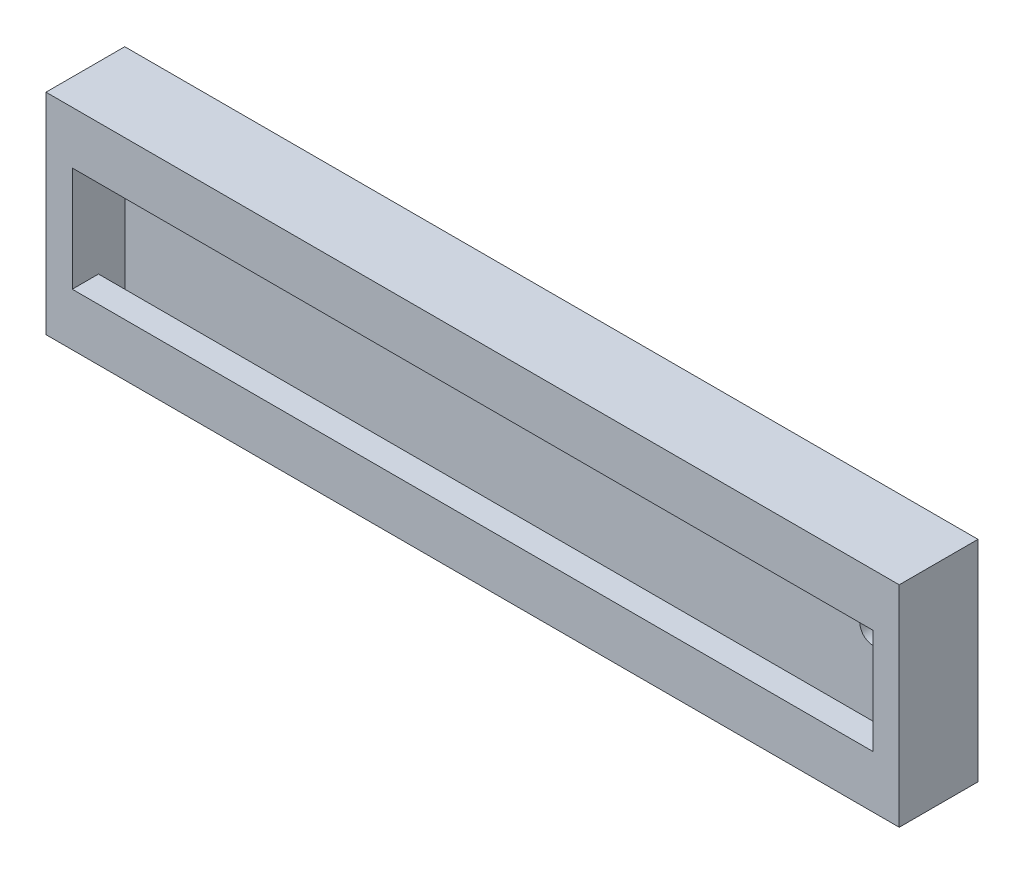
ISO-10303-21;
HEADER;
FILE_DESCRIPTION(('STEP AP214'),'2;1');
FILE_NAME('part.step','',(''),(''),'','','');
FILE_SCHEMA(('AUTOMOTIVE_DESIGN { 1 0 10303 214 1 1 1 1 }'));
ENDSEC;
DATA;
#1=APPLICATION_CONTEXT('core data for automotive mechanical design processes');
#2=APPLICATION_PROTOCOL_DEFINITION('international standard','automotive_design',2000,#1);
#3=PRODUCT_CONTEXT('',#1,'mechanical');
#4=PRODUCT('Part','Part','',(#3));
#5=PRODUCT_RELATED_PRODUCT_CATEGORY('part','',(#4));
#6=PRODUCT_DEFINITION_FORMATION('','',#4);
#7=PRODUCT_DEFINITION_CONTEXT('part definition',#1,'design');
#8=PRODUCT_DEFINITION('design','',#6,#7);
#9=PRODUCT_DEFINITION_SHAPE('','',#8);
#10=(LENGTH_UNIT() NAMED_UNIT(*) SI_UNIT(.MILLI.,.METRE.));
#11=(NAMED_UNIT(*) PLANE_ANGLE_UNIT() SI_UNIT($,.RADIAN.));
#12=(NAMED_UNIT(*) SI_UNIT($,.STERADIAN.) SOLID_ANGLE_UNIT());
#13=UNCERTAINTY_MEASURE_WITH_UNIT(LENGTH_MEASURE(1.E-05),#10,'distance_accuracy_value','');
#14=(GEOMETRIC_REPRESENTATION_CONTEXT(3) GLOBAL_UNCERTAINTY_ASSIGNED_CONTEXT((#13)) GLOBAL_UNIT_ASSIGNED_CONTEXT((#10,
#11,#12)) REPRESENTATION_CONTEXT('',''));
#15=CARTESIAN_POINT('',(0.,0.,0.));
#16=DIRECTION('',(0.,0.,1.));
#17=DIRECTION('',(1.,0.,0.));
#18=AXIS2_PLACEMENT_3D('',#15,#16,#17);
#19=CARTESIAN_POINT('',(32.5,-8.,2.));
#20=DIRECTION('',(-1.,0.,0.));
#21=DIRECTION('',(0.,0.,1.));
#22=AXIS2_PLACEMENT_3D('',#19,#20,#21);
#23=PLANE('',#22);
#24=DIRECTION('',(0.,1.,0.));
#25=VECTOR('',#24,1.);
#26=CARTESIAN_POINT('',(32.5,-8.,0.));
#27=LINE('',#26,#25);
#28=CARTESIAN_POINT('',(32.5,-8.,0.));
#29=VERTEX_POINT('',#28);
#30=CARTESIAN_POINT('',(32.5,8.,0.));
#31=VERTEX_POINT('',#30);
#32=EDGE_CURVE('E215',#29,#31,#27,.T.);
#33=ORIENTED_EDGE('',*,*,#32,.T.);
#34=DIRECTION('',(0.,0.,-1.));
#35=VECTOR('',#34,1.);
#36=CARTESIAN_POINT('',(32.5,8.,2.));
#37=LINE('',#36,#35);
#38=CARTESIAN_POINT('',(32.5,8.,6.));
#39=VERTEX_POINT('',#38);
#40=EDGE_CURVE('E11',#39,#31,#37,.T.);
#41=ORIENTED_EDGE('',*,*,#40,.F.);
#42=DIRECTION('',(0.,1.,0.));
#43=VECTOR('',#42,1.);
#44=CARTESIAN_POINT('',(32.5,8.,6.));
#45=LINE('',#44,#43);
#46=CARTESIAN_POINT('',(32.5,-8.,6.));
#47=VERTEX_POINT('',#46);
#48=EDGE_CURVE('E150',#47,#39,#45,.T.);
#49=ORIENTED_EDGE('',*,*,#48,.F.);
#50=DIRECTION('',(0.,0.,-1.));
#51=VECTOR('',#50,1.);
#52=CARTESIAN_POINT('',(32.5,-8.,2.));
#53=LINE('',#52,#51);
#54=EDGE_CURVE('E223',#47,#29,#53,.T.);
#55=ORIENTED_EDGE('',*,*,#54,.T.);
#56=EDGE_LOOP('',(#33,#41,#49,#55));
#57=FACE_BOUND('',#56,.T.);
#58=ADVANCED_FACE('F39',(#57),#23,.F.);
#59=CARTESIAN_POINT('',(-32.5,8.,2.));
#60=DIRECTION('',(0.,-1.,0.));
#61=DIRECTION('',(0.,0.,-1.));
#62=AXIS2_PLACEMENT_3D('',#59,#60,#61);
#63=PLANE('',#62);
#64=DIRECTION('',(-1.,0.,0.));
#65=VECTOR('',#64,1.);
#66=CARTESIAN_POINT('',(-32.5,8.,0.));
#67=LINE('',#66,#65);
#68=CARTESIAN_POINT('',(-32.5,8.,0.));
#69=VERTEX_POINT('',#68);
#70=EDGE_CURVE('E218',#31,#69,#67,.T.);
#71=ORIENTED_EDGE('',*,*,#70,.T.);
#72=DIRECTION('',(0.,0.,-1.));
#73=VECTOR('',#72,1.);
#74=CARTESIAN_POINT('',(-32.5,8.,2.));
#75=LINE('',#74,#73);
#76=CARTESIAN_POINT('',(-32.5,8.,6.));
#77=VERTEX_POINT('',#76);
#78=EDGE_CURVE('E46',#77,#69,#75,.T.);
#79=ORIENTED_EDGE('',*,*,#78,.F.);
#80=DIRECTION('',(-1.,0.,0.));
#81=VECTOR('',#80,1.);
#82=CARTESIAN_POINT('',(-32.5,8.,6.));
#83=LINE('',#82,#81);
#84=EDGE_CURVE('E174',#39,#77,#83,.T.);
#85=ORIENTED_EDGE('',*,*,#84,.F.);
#86=ORIENTED_EDGE('',*,*,#40,.T.);
#87=EDGE_LOOP('',(#71,#79,#85,#86));
#88=FACE_BOUND('',#87,.T.);
#89=ADVANCED_FACE('F241',(#88),#63,.F.);
#90=CARTESIAN_POINT('',(-32.5,-8.,2.));
#91=DIRECTION('',(1.,0.,0.));
#92=DIRECTION('',(0.,0.,-1.));
#93=AXIS2_PLACEMENT_3D('',#90,#91,#92);
#94=PLANE('',#93);
#95=DIRECTION('',(0.,-1.,0.));
#96=VECTOR('',#95,1.);
#97=CARTESIAN_POINT('',(-32.5,-8.,0.));
#98=LINE('',#97,#96);
#99=CARTESIAN_POINT('',(-32.5,-8.,0.));
#100=VERTEX_POINT('',#99);
#101=EDGE_CURVE('E220',#69,#100,#98,.T.);
#102=ORIENTED_EDGE('',*,*,#101,.T.);
#103=DIRECTION('',(0.,0.,-1.));
#104=VECTOR('',#103,1.);
#105=CARTESIAN_POINT('',(-32.5,-8.,2.));
#106=LINE('',#105,#104);
#107=CARTESIAN_POINT('',(-32.5,-8.,6.));
#108=VERTEX_POINT('',#107);
#109=EDGE_CURVE('E225',#108,#100,#106,.T.);
#110=ORIENTED_EDGE('',*,*,#109,.F.);
#111=DIRECTION('',(0.,-1.,0.));
#112=VECTOR('',#111,1.);
#113=CARTESIAN_POINT('',(-32.5,8.,6.));
#114=LINE('',#113,#112);
#115=EDGE_CURVE('E177',#77,#108,#114,.T.);
#116=ORIENTED_EDGE('',*,*,#115,.F.);
#117=ORIENTED_EDGE('',*,*,#78,.T.);
#118=EDGE_LOOP('',(#102,#110,#116,#117));
#119=FACE_BOUND('',#118,.T.);
#120=ADVANCED_FACE('F230',(#119),#94,.F.);
#121=CARTESIAN_POINT('',(-32.5,-8.,2.));
#122=DIRECTION('',(0.,1.,0.));
#123=DIRECTION('',(0.,0.,1.));
#124=AXIS2_PLACEMENT_3D('',#121,#122,#123);
#125=PLANE('',#124);
#126=DIRECTION('',(1.,0.,0.));
#127=VECTOR('',#126,1.);
#128=CARTESIAN_POINT('',(-32.5,-8.,0.));
#129=LINE('',#128,#127);
#130=EDGE_CURVE('E61',#100,#29,#129,.T.);
#131=ORIENTED_EDGE('',*,*,#130,.T.);
#132=ORIENTED_EDGE('',*,*,#54,.F.);
#133=DIRECTION('',(1.,0.,0.));
#134=VECTOR('',#133,1.);
#135=CARTESIAN_POINT('',(-32.5,-8.,6.));
#136=LINE('',#135,#134);
#137=EDGE_CURVE('E180',#108,#47,#136,.T.);
#138=ORIENTED_EDGE('',*,*,#137,.F.);
#139=ORIENTED_EDGE('',*,*,#109,.T.);
#140=EDGE_LOOP('',(#131,#132,#138,#139));
#141=FACE_BOUND('',#140,.T.);
#142=ADVANCED_FACE('F239',(#141),#125,.F.);
#143=CARTESIAN_POINT('',(0.,0.,0.));
#144=DIRECTION('',(0.,0.,-1.));
#145=DIRECTION('',(-1.,0.,0.));
#146=AXIS2_PLACEMENT_3D('',#143,#144,#145);
#147=PLANE('',#146);
#148=CARTESIAN_POINT('',(26.5,0.,0.));
#149=DIRECTION('',(0.,0.,1.));
#150=DIRECTION('',(1.,0.,0.));
#151=AXIS2_PLACEMENT_3D('',#148,#149,#150);
#152=CIRCLE('',#151,1.);
#153=CARTESIAN_POINT('',(27.5,0.,0.));
#154=VERTEX_POINT('',#153);
#155=EDGE_CURVE('E164',#154,#154,#152,.T.);
#156=ORIENTED_EDGE('',*,*,#155,.T.);
#157=EDGE_LOOP('',(#156));
#158=FACE_BOUND('',#157,.T.);
#159=ORIENTED_EDGE('',*,*,#32,.F.);
#160=ORIENTED_EDGE('',*,*,#130,.F.);
#161=ORIENTED_EDGE('',*,*,#101,.F.);
#162=ORIENTED_EDGE('',*,*,#70,.F.);
#163=EDGE_LOOP('',(#159,#160,#161,#162));
#164=FACE_BOUND('',#163,.T.);
#165=ADVANCED_FACE('F235',(#158,#164),#147,.T.);
#166=CARTESIAN_POINT('',(0.,0.,4.));
#167=DIRECTION('',(0.,0.,1.));
#168=DIRECTION('',(1.,0.,0.));
#169=AXIS2_PLACEMENT_3D('',#166,#167,#168);
#170=PLANE('',#169);
#171=DIRECTION('',(0.,1.,0.));
#172=VECTOR('',#171,1.);
#173=CARTESIAN_POINT('',(30.5,6.,4.));
#174=LINE('',#173,#172);
#175=CARTESIAN_POINT('',(30.5,4.,4.));
#176=VERTEX_POINT('',#175);
#177=CARTESIAN_POINT('',(30.5,6.,4.));
#178=VERTEX_POINT('',#177);
#179=EDGE_CURVE('E187',#176,#178,#174,.T.);
#180=ORIENTED_EDGE('',*,*,#179,.F.);
#181=DIRECTION('',(-1.,0.,0.));
#182=VECTOR('',#181,1.);
#183=CARTESIAN_POINT('',(-30.5,4.,4.));
#184=LINE('',#183,#182);
#185=CARTESIAN_POINT('',(-30.5,4.,4.));
#186=VERTEX_POINT('',#185);
#187=EDGE_CURVE('E149',#176,#186,#184,.T.);
#188=ORIENTED_EDGE('',*,*,#187,.T.);
#189=DIRECTION('',(0.,-1.,0.));
#190=VECTOR('',#189,1.);
#191=CARTESIAN_POINT('',(-30.5,6.,4.));
#192=LINE('',#191,#190);
#193=CARTESIAN_POINT('',(-30.5,6.,4.));
#194=VERTEX_POINT('',#193);
#195=EDGE_CURVE('E191',#194,#186,#192,.T.);
#196=ORIENTED_EDGE('',*,*,#195,.F.);
#197=DIRECTION('',(-1.,0.,0.));
#198=VECTOR('',#197,1.);
#199=CARTESIAN_POINT('',(-30.5,6.,4.));
#200=LINE('',#199,#198);
#201=EDGE_CURVE('E186',#178,#194,#200,.T.);
#202=ORIENTED_EDGE('',*,*,#201,.F.);
#203=EDGE_LOOP('',(#180,#188,#196,#202));
#204=FACE_BOUND('',#203,.T.);
#205=ADVANCED_FACE('F253',(#204),#170,.F.);
#206=CARTESIAN_POINT('',(0.,0.,6.));
#207=DIRECTION('',(0.,0.,1.));
#208=DIRECTION('',(1.,0.,0.));
#209=AXIS2_PLACEMENT_3D('',#206,#207,#208);
#210=PLANE('',#209);
#211=ORIENTED_EDGE('',*,*,#48,.T.);
#212=ORIENTED_EDGE('',*,*,#84,.T.);
#213=ORIENTED_EDGE('',*,*,#115,.T.);
#214=ORIENTED_EDGE('',*,*,#137,.T.);
#215=EDGE_LOOP('',(#211,#212,#213,#214));
#216=FACE_BOUND('',#215,.T.);
#217=DIRECTION('',(-1.,0.,0.));
#218=VECTOR('',#217,1.);
#219=CARTESIAN_POINT('',(-30.5,4.,6.));
#220=LINE('',#219,#218);
#221=CARTESIAN_POINT('',(30.5,4.,6.));
#222=VERTEX_POINT('',#221);
#223=CARTESIAN_POINT('',(-30.5,4.,6.));
#224=VERTEX_POINT('',#223);
#225=EDGE_CURVE('E141',#222,#224,#220,.T.);
#226=ORIENTED_EDGE('',*,*,#225,.F.);
#227=DIRECTION('',(0.,1.,0.));
#228=VECTOR('',#227,1.);
#229=CARTESIAN_POINT('',(30.5,4.,6.));
#230=LINE('',#229,#228);
#231=CARTESIAN_POINT('',(30.5,-4.,6.));
#232=VERTEX_POINT('',#231);
#233=EDGE_CURVE('E131',#232,#222,#230,.T.);
#234=ORIENTED_EDGE('',*,*,#233,.F.);
#235=DIRECTION('',(1.,0.,0.));
#236=VECTOR('',#235,1.);
#237=CARTESIAN_POINT('',(-30.5,-4.,6.));
#238=LINE('',#237,#236);
#239=CARTESIAN_POINT('',(-30.5,-4.,6.));
#240=VERTEX_POINT('',#239);
#241=EDGE_CURVE('E158',#240,#232,#238,.T.);
#242=ORIENTED_EDGE('',*,*,#241,.F.);
#243=DIRECTION('',(0.,-1.,0.));
#244=VECTOR('',#243,1.);
#245=CARTESIAN_POINT('',(-30.5,4.,6.));
#246=LINE('',#245,#244);
#247=EDGE_CURVE('E156',#224,#240,#246,.T.);
#248=ORIENTED_EDGE('',*,*,#247,.F.);
#249=EDGE_LOOP('',(#226,#234,#242,#248));
#250=FACE_BOUND('',#249,.T.);
#251=ADVANCED_FACE('F154',(#216,#250),#210,.T.);
#252=CARTESIAN_POINT('',(30.5,-6.,4.));
#253=VERTEX_POINT('',#252);
#254=CARTESIAN_POINT('',(30.5,-4.,4.));
#255=VERTEX_POINT('',#254);
#256=EDGE_CURVE('E184',#253,#255,#174,.T.);
#257=ORIENTED_EDGE('',*,*,#256,.F.);
#258=DIRECTION('',(1.,0.,0.));
#259=VECTOR('',#258,1.);
#260=CARTESIAN_POINT('',(-30.5,-6.,4.));
#261=LINE('',#260,#259);
#262=CARTESIAN_POINT('',(-30.5,-6.,4.));
#263=VERTEX_POINT('',#262);
#264=EDGE_CURVE('E194',#263,#253,#261,.T.);
#265=ORIENTED_EDGE('',*,*,#264,.F.);
#266=CARTESIAN_POINT('',(-30.5,-4.,4.));
#267=VERTEX_POINT('',#266);
#268=EDGE_CURVE('E190',#267,#263,#192,.T.);
#269=ORIENTED_EDGE('',*,*,#268,.F.);
#270=DIRECTION('',(1.,0.,0.));
#271=VECTOR('',#270,1.);
#272=CARTESIAN_POINT('',(-30.5,-4.,4.));
#273=LINE('',#272,#271);
#274=EDGE_CURVE('E142',#267,#255,#273,.T.);
#275=ORIENTED_EDGE('',*,*,#274,.T.);
#276=EDGE_LOOP('',(#257,#265,#269,#275));
#277=FACE_BOUND('',#276,.T.);
#278=ADVANCED_FACE('F274',(#277),#170,.F.);
#279=CARTESIAN_POINT('',(-30.5,4.,6.));
#280=DIRECTION('',(0.,-1.,0.));
#281=DIRECTION('',(0.,0.,-1.));
#282=AXIS2_PLACEMENT_3D('',#279,#280,#281);
#283=PLANE('',#282);
#284=ORIENTED_EDGE('',*,*,#187,.F.);
#285=DIRECTION('',(0.,0.,-1.));
#286=VECTOR('',#285,1.);
#287=CARTESIAN_POINT('',(30.5,4.,6.));
#288=LINE('',#287,#286);
#289=EDGE_CURVE('E135',#222,#176,#288,.T.);
#290=ORIENTED_EDGE('',*,*,#289,.F.);
#291=ORIENTED_EDGE('',*,*,#225,.T.);
#292=DIRECTION('',(0.,0.,-1.));
#293=VECTOR('',#292,1.);
#294=CARTESIAN_POINT('',(-30.5,4.,6.));
#295=LINE('',#294,#293);
#296=EDGE_CURVE('E151',#224,#186,#295,.T.);
#297=ORIENTED_EDGE('',*,*,#296,.T.);
#298=EDGE_LOOP('',(#284,#290,#291,#297));
#299=FACE_BOUND('',#298,.T.);
#300=ADVANCED_FACE('F146',(#299),#283,.T.);
#301=CARTESIAN_POINT('',(-30.5,-4.,6.));
#302=DIRECTION('',(0.,1.,0.));
#303=DIRECTION('',(0.,0.,1.));
#304=AXIS2_PLACEMENT_3D('',#301,#302,#303);
#305=PLANE('',#304);
#306=ORIENTED_EDGE('',*,*,#274,.F.);
#307=DIRECTION('',(0.,0.,-1.));
#308=VECTOR('',#307,1.);
#309=CARTESIAN_POINT('',(-30.5,-4.,6.));
#310=LINE('',#309,#308);
#311=EDGE_CURVE('E168',#240,#267,#310,.T.);
#312=ORIENTED_EDGE('',*,*,#311,.F.);
#313=ORIENTED_EDGE('',*,*,#241,.T.);
#314=DIRECTION('',(0.,0.,-1.));
#315=VECTOR('',#314,1.);
#316=CARTESIAN_POINT('',(30.5,-4.,6.));
#317=LINE('',#316,#315);
#318=EDGE_CURVE('E137',#232,#255,#317,.T.);
#319=ORIENTED_EDGE('',*,*,#318,.T.);
#320=EDGE_LOOP('',(#306,#312,#313,#319));
#321=FACE_BOUND('',#320,.T.);
#322=ADVANCED_FACE('F259',(#321),#305,.T.);
#323=CARTESIAN_POINT('',(0.,0.,2.));
#324=DIRECTION('',(0.,0.,-1.));
#325=DIRECTION('',(-1.,0.,0.));
#326=AXIS2_PLACEMENT_3D('',#323,#324,#325);
#327=PLANE('',#326);
#328=CARTESIAN_POINT('',(26.5,0.,2.));
#329=DIRECTION('',(0.,0.,1.));
#330=DIRECTION('',(1.,0.,0.));
#331=AXIS2_PLACEMENT_3D('',#328,#329,#330);
#332=CIRCLE('',#331,1.);
#333=CARTESIAN_POINT('',(27.5,0.,2.));
#334=VERTEX_POINT('',#333);
#335=EDGE_CURVE('E294',#334,#334,#332,.T.);
#336=ORIENTED_EDGE('',*,*,#335,.F.);
#337=EDGE_LOOP('',(#336));
#338=FACE_BOUND('',#337,.T.);
#339=DIRECTION('',(1.,0.,0.));
#340=VECTOR('',#339,1.);
#341=CARTESIAN_POINT('',(-30.5,-6.,2.));
#342=LINE('',#341,#340);
#343=CARTESIAN_POINT('',(-30.5,-6.,2.));
#344=VERTEX_POINT('',#343);
#345=CARTESIAN_POINT('',(30.5,-6.,2.));
#346=VERTEX_POINT('',#345);
#347=EDGE_CURVE('E204',#344,#346,#342,.T.);
#348=ORIENTED_EDGE('',*,*,#347,.T.);
#349=DIRECTION('',(0.,1.,0.));
#350=VECTOR('',#349,1.);
#351=CARTESIAN_POINT('',(30.5,6.,2.));
#352=LINE('',#351,#350);
#353=CARTESIAN_POINT('',(30.5,6.,2.));
#354=VERTEX_POINT('',#353);
#355=EDGE_CURVE('E183',#346,#354,#352,.T.);
#356=ORIENTED_EDGE('',*,*,#355,.T.);
#357=DIRECTION('',(-1.,0.,0.));
#358=VECTOR('',#357,1.);
#359=CARTESIAN_POINT('',(-30.5,6.,2.));
#360=LINE('',#359,#358);
#361=CARTESIAN_POINT('',(-30.5,6.,2.));
#362=VERTEX_POINT('',#361);
#363=EDGE_CURVE('E198',#354,#362,#360,.T.);
#364=ORIENTED_EDGE('',*,*,#363,.T.);
#365=DIRECTION('',(0.,-1.,0.));
#366=VECTOR('',#365,1.);
#367=CARTESIAN_POINT('',(-30.5,6.,2.));
#368=LINE('',#367,#366);
#369=EDGE_CURVE('E201',#362,#344,#368,.T.);
#370=ORIENTED_EDGE('',*,*,#369,.T.);
#371=EDGE_LOOP('',(#348,#356,#364,#370));
#372=FACE_BOUND('',#371,.T.);
#373=ADVANCED_FACE('F255',(#338,#372),#327,.F.);
#374=CARTESIAN_POINT('',(-30.5,6.,4.));
#375=DIRECTION('',(1.,0.,0.));
#376=DIRECTION('',(0.,0.,-1.));
#377=AXIS2_PLACEMENT_3D('',#374,#375,#376);
#378=PLANE('',#377);
#379=ORIENTED_EDGE('',*,*,#369,.F.);
#380=DIRECTION('',(0.,0.,-1.));
#381=VECTOR('',#380,1.);
#382=CARTESIAN_POINT('',(-30.5,6.,4.));
#383=LINE('',#382,#381);
#384=EDGE_CURVE('E210',#194,#362,#383,.T.);
#385=ORIENTED_EDGE('',*,*,#384,.F.);
#386=ORIENTED_EDGE('',*,*,#195,.T.);
#387=ORIENTED_EDGE('',*,*,#296,.F.);
#388=ORIENTED_EDGE('',*,*,#247,.T.);
#389=ORIENTED_EDGE('',*,*,#311,.T.);
#390=ORIENTED_EDGE('',*,*,#268,.T.);
#391=DIRECTION('',(0.,0.,-1.));
#392=VECTOR('',#391,1.);
#393=CARTESIAN_POINT('',(-30.5,-6.,4.));
#394=LINE('',#393,#392);
#395=EDGE_CURVE('E208',#263,#344,#394,.T.);
#396=ORIENTED_EDGE('',*,*,#395,.T.);
#397=EDGE_LOOP('',(#379,#385,#386,#387,#388,#389,#390,#396));
#398=FACE_BOUND('',#397,.T.);
#399=ADVANCED_FACE('F258',(#398),#378,.T.);
#400=CARTESIAN_POINT('',(-30.5,-6.,4.));
#401=DIRECTION('',(0.,1.,0.));
#402=DIRECTION('',(0.,0.,1.));
#403=AXIS2_PLACEMENT_3D('',#400,#401,#402);
#404=PLANE('',#403);
#405=ORIENTED_EDGE('',*,*,#347,.F.);
#406=ORIENTED_EDGE('',*,*,#395,.F.);
#407=ORIENTED_EDGE('',*,*,#264,.T.);
#408=DIRECTION('',(0.,0.,-1.));
#409=VECTOR('',#408,1.);
#410=CARTESIAN_POINT('',(30.5,-6.,4.));
#411=LINE('',#410,#409);
#412=EDGE_CURVE('E53',#253,#346,#411,.T.);
#413=ORIENTED_EDGE('',*,*,#412,.T.);
#414=EDGE_LOOP('',(#405,#406,#407,#413));
#415=FACE_BOUND('',#414,.T.);
#416=ADVANCED_FACE('F264',(#415),#404,.T.);
#417=CARTESIAN_POINT('',(30.5,6.,4.));
#418=DIRECTION('',(-1.,0.,0.));
#419=DIRECTION('',(0.,0.,1.));
#420=AXIS2_PLACEMENT_3D('',#417,#418,#419);
#421=PLANE('',#420);
#422=ORIENTED_EDGE('',*,*,#355,.F.);
#423=ORIENTED_EDGE('',*,*,#412,.F.);
#424=ORIENTED_EDGE('',*,*,#256,.T.);
#425=ORIENTED_EDGE('',*,*,#318,.F.);
#426=ORIENTED_EDGE('',*,*,#233,.T.);
#427=ORIENTED_EDGE('',*,*,#289,.T.);
#428=ORIENTED_EDGE('',*,*,#179,.T.);
#429=DIRECTION('',(0.,0.,-1.));
#430=VECTOR('',#429,1.);
#431=CARTESIAN_POINT('',(30.5,6.,4.));
#432=LINE('',#431,#430);
#433=EDGE_CURVE('E212',#178,#354,#432,.T.);
#434=ORIENTED_EDGE('',*,*,#433,.T.);
#435=EDGE_LOOP('',(#422,#423,#424,#425,#426,#427,#428,#434));
#436=FACE_BOUND('',#435,.T.);
#437=ADVANCED_FACE('F133',(#436),#421,.T.);
#438=CARTESIAN_POINT('',(-30.5,6.,4.));
#439=DIRECTION('',(0.,-1.,0.));
#440=DIRECTION('',(0.,0.,-1.));
#441=AXIS2_PLACEMENT_3D('',#438,#439,#440);
#442=PLANE('',#441);
#443=ORIENTED_EDGE('',*,*,#363,.F.);
#444=ORIENTED_EDGE('',*,*,#433,.F.);
#445=ORIENTED_EDGE('',*,*,#201,.T.);
#446=ORIENTED_EDGE('',*,*,#384,.T.);
#447=EDGE_LOOP('',(#443,#444,#445,#446));
#448=FACE_BOUND('',#447,.T.);
#449=ADVANCED_FACE('F263',(#448),#442,.T.);
#450=CARTESIAN_POINT('',(26.5,0.,0.));
#451=DIRECTION('',(0.,0.,1.));
#452=DIRECTION('',(1.,0.,0.));
#453=AXIS2_PLACEMENT_3D('',#450,#451,#452);
#454=CYLINDRICAL_SURFACE('',#453,1.);
#455=ORIENTED_EDGE('',*,*,#155,.F.);
#456=EDGE_LOOP('',(#455));
#457=FACE_BOUND('',#456,.T.);
#458=ORIENTED_EDGE('',*,*,#335,.T.);
#459=EDGE_LOOP('',(#458));
#460=FACE_BOUND('',#459,.T.);
#461=ADVANCED_FACE('F267',(#457,#460),#454,.F.);
#462=CLOSED_SHELL('',(#58,#89,#120,#142,#165,#205,#251,#278,#300,#322,#373,#399,#416,#437,#449,#461));
#463=MANIFOLD_SOLID_BREP('B2',#462);
#464=ADVANCED_BREP_SHAPE_REPRESENTATION('',(#18,#463),#14);
#465=SHAPE_DEFINITION_REPRESENTATION(#9,#464);
ENDSEC;
END-ISO-10303-21;
